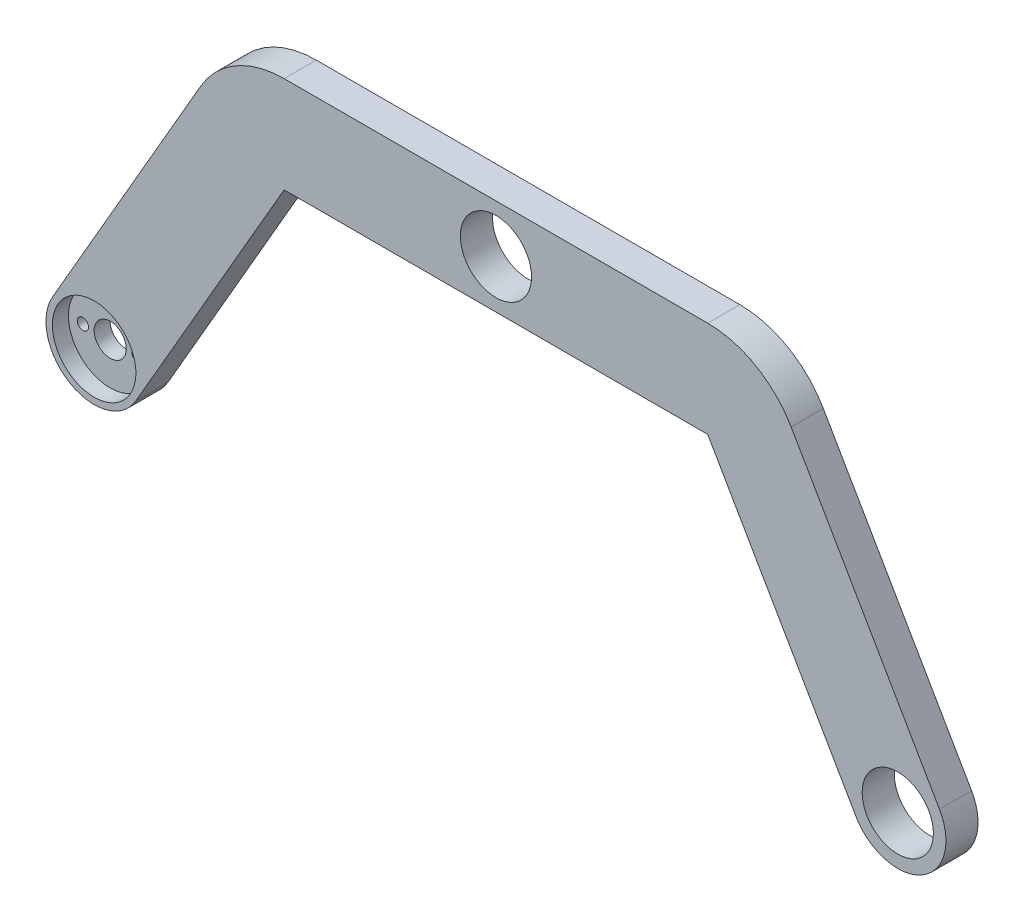
ISO-10303-21;
HEADER;
FILE_DESCRIPTION(('STEP AP214'),'2;1');
FILE_NAME('part.step','',(''),(''),'','','');
FILE_SCHEMA(('AUTOMOTIVE_DESIGN { 1 0 10303 214 1 1 1 1 }'));
ENDSEC;
DATA;
#1=APPLICATION_CONTEXT('core data for automotive mechanical design processes');
#2=APPLICATION_PROTOCOL_DEFINITION('international standard','automotive_design',2000,#1);
#3=PRODUCT_CONTEXT('',#1,'mechanical');
#4=PRODUCT('Part','Part','',(#3));
#5=PRODUCT_RELATED_PRODUCT_CATEGORY('part','',(#4));
#6=PRODUCT_DEFINITION_FORMATION('','',#4);
#7=PRODUCT_DEFINITION_CONTEXT('part definition',#1,'design');
#8=PRODUCT_DEFINITION('design','',#6,#7);
#9=PRODUCT_DEFINITION_SHAPE('','',#8);
#10=(LENGTH_UNIT() NAMED_UNIT(*) SI_UNIT(.MILLI.,.METRE.));
#11=(NAMED_UNIT(*) PLANE_ANGLE_UNIT() SI_UNIT($,.RADIAN.));
#12=(NAMED_UNIT(*) SI_UNIT($,.STERADIAN.) SOLID_ANGLE_UNIT());
#13=UNCERTAINTY_MEASURE_WITH_UNIT(LENGTH_MEASURE(1.E-05),#10,'distance_accuracy_value','');
#14=(GEOMETRIC_REPRESENTATION_CONTEXT(3) GLOBAL_UNCERTAINTY_ASSIGNED_CONTEXT((#13)) GLOBAL_UNIT_ASSIGNED_CONTEXT((#10,
#11,#12)) REPRESENTATION_CONTEXT('',''));
#15=CARTESIAN_POINT('',(0.,0.,0.));
#16=DIRECTION('',(0.,0.,1.));
#17=DIRECTION('',(1.,0.,0.));
#18=AXIS2_PLACEMENT_3D('',#15,#16,#17);
#19=CARTESIAN_POINT('',(-133.644870925994,-87.5182766758698,-10.));
#20=DIRECTION('',(0.,0.,1.));
#21=DIRECTION('',(-1.,0.,0.));
#22=AXIS2_PLACEMENT_3D('',#19,#20,#21);
#23=CYLINDRICAL_SURFACE('',#22,1.75000000000001);
#24=CARTESIAN_POINT('',(-133.644870925994,-87.5182766758698,-10.));
#25=DIRECTION('',(0.,0.,1.));
#26=DIRECTION('',(1.,0.,0.));
#27=AXIS2_PLACEMENT_3D('',#24,#25,#26);
#28=CIRCLE('',#27,1.75000000000001);
#29=CARTESIAN_POINT('',(-131.894870925994,-87.5182766758698,-10.));
#30=VERTEX_POINT('',#29);
#31=EDGE_CURVE('E156',#30,#30,#28,.T.);
#32=ORIENTED_EDGE('',*,*,#31,.F.);
#33=EDGE_LOOP('',(#32));
#34=FACE_BOUND('',#33,.T.);
#35=CARTESIAN_POINT('',(-133.644870925994,-87.5182766758698,-5.));
#36=DIRECTION('',(0.,0.,-1.));
#37=DIRECTION('',(-1.,0.,0.));
#38=AXIS2_PLACEMENT_3D('',#35,#36,#37);
#39=CIRCLE('',#38,1.75000000000001);
#40=CARTESIAN_POINT('',(-135.394870925994,-87.5182766758698,-5.));
#41=VERTEX_POINT('',#40);
#42=EDGE_CURVE('E446',#41,#41,#39,.T.);
#43=ORIENTED_EDGE('',*,*,#42,.F.);
#44=EDGE_LOOP('',(#43));
#45=FACE_BOUND('',#44,.T.);
#46=ADVANCED_FACE('F41',(#34,#45),#23,.F.);
#47=CARTESIAN_POINT('',(-116.644870925994,-87.5182766758698,-10.));
#48=DIRECTION('',(0.,0.,1.));
#49=DIRECTION('',(-1.,0.,0.));
#50=AXIS2_PLACEMENT_3D('',#47,#48,#49);
#51=CYLINDRICAL_SURFACE('',#50,1.75000000000004);
#52=CARTESIAN_POINT('',(-116.644870925994,-87.5182766758698,-10.));
#53=DIRECTION('',(0.,0.,1.));
#54=DIRECTION('',(1.,0.,0.));
#55=AXIS2_PLACEMENT_3D('',#52,#53,#54);
#56=CIRCLE('',#55,1.75000000000004);
#57=CARTESIAN_POINT('',(-114.894870925994,-87.5182766758698,-10.));
#58=VERTEX_POINT('',#57);
#59=EDGE_CURVE('E465',#58,#58,#56,.T.);
#60=ORIENTED_EDGE('',*,*,#59,.F.);
#61=EDGE_LOOP('',(#60));
#62=FACE_BOUND('',#61,.T.);
#63=CARTESIAN_POINT('',(-116.644870925994,-87.5182766758698,-5.));
#64=DIRECTION('',(0.,0.,-1.));
#65=DIRECTION('',(-1.,0.,0.));
#66=AXIS2_PLACEMENT_3D('',#63,#64,#65);
#67=CIRCLE('',#66,1.75000000000004);
#68=CARTESIAN_POINT('',(-118.394870925994,-87.5182766758698,-5.));
#69=VERTEX_POINT('',#68);
#70=EDGE_CURVE('E443',#69,#69,#67,.T.);
#71=ORIENTED_EDGE('',*,*,#70,.F.);
#72=EDGE_LOOP('',(#71));
#73=FACE_BOUND('',#72,.T.);
#74=ADVANCED_FACE('F239',(#62,#73),#51,.F.);
#75=CARTESIAN_POINT('',(-125.144870925994,-87.5182766758698,31.3601857456234));
#76=DIRECTION('',(0.,0.,-1.));
#77=DIRECTION('',(1.,0.,0.));
#78=AXIS2_PLACEMENT_3D('',#75,#76,#77);
#79=CYLINDRICAL_SURFACE('',#78,5.00000000000001);
#80=CARTESIAN_POINT('',(-125.144870925994,-87.5182766758698,-10.));
#81=DIRECTION('',(0.,0.,1.));
#82=DIRECTION('',(1.,0.,0.));
#83=AXIS2_PLACEMENT_3D('',#80,#81,#82);
#84=CIRCLE('',#83,5.00000000000001);
#85=CARTESIAN_POINT('',(-120.144870925994,-87.5182766758698,-10.));
#86=VERTEX_POINT('',#85);
#87=EDGE_CURVE('E439',#86,#86,#84,.T.);
#88=ORIENTED_EDGE('',*,*,#87,.F.);
#89=EDGE_LOOP('',(#88));
#90=FACE_BOUND('',#89,.T.);
#91=CARTESIAN_POINT('',(-125.144870925994,-87.5182766758698,-5.));
#92=DIRECTION('',(0.,0.,-1.));
#93=DIRECTION('',(-1.,0.,0.));
#94=AXIS2_PLACEMENT_3D('',#91,#92,#93);
#95=CIRCLE('',#94,5.00000000000001);
#96=CARTESIAN_POINT('',(-130.144870925994,-87.5182766758698,-5.));
#97=VERTEX_POINT('',#96);
#98=EDGE_CURVE('E45',#97,#97,#95,.F.);
#99=ORIENTED_EDGE('',*,*,#98,.T.);
#100=EDGE_LOOP('',(#99));
#101=FACE_BOUND('',#100,.T.);
#102=ADVANCED_FACE('F245',(#90,#101),#79,.F.);
#103=CARTESIAN_POINT('',(-65.9559162903232,-15.,-10.));
#104=DIRECTION('',(0.,0.,1.));
#105=DIRECTION('',(-1.,0.,0.));
#106=AXIS2_PLACEMENT_3D('',#103,#104,#105);
#107=PLANE('',#106);
#108=CARTESIAN_POINT('',(0.,0.,-10.));
#109=DIRECTION('',(0.,0.,1.));
#110=DIRECTION('',(1.,0.,0.));
#111=AXIS2_PLACEMENT_3D('',#108,#109,#110);
#112=CIRCLE('',#111,11.0875);
#113=CARTESIAN_POINT('',(11.0875,0.,-10.));
#114=VERTEX_POINT('',#113);
#115=EDGE_CURVE('E459',#114,#114,#112,.T.);
#116=ORIENTED_EDGE('',*,*,#115,.T.);
#117=EDGE_LOOP('',(#116));
#118=FACE_BOUND('',#117,.T.);
#119=ORIENTED_EDGE('',*,*,#87,.T.);
#120=EDGE_LOOP('',(#119));
#121=FACE_BOUND('',#120,.T.);
#122=CARTESIAN_POINT('',(125.144870925994,-87.5182766758698,-10.));
#123=DIRECTION('',(0.,0.,1.));
#124=DIRECTION('',(1.,0.,0.));
#125=AXIS2_PLACEMENT_3D('',#122,#123,#124);
#126=CIRCLE('',#125,11.0875);
#127=CARTESIAN_POINT('',(136.232370925994,-87.5182766758698,-10.));
#128=VERTEX_POINT('',#127);
#129=EDGE_CURVE('E467',#128,#128,#126,.T.);
#130=ORIENTED_EDGE('',*,*,#129,.T.);
#131=EDGE_LOOP('',(#130));
#132=FACE_BOUND('',#131,.T.);
#133=CARTESIAN_POINT('',(-65.9559162903232,-15.,-10.));
#134=DIRECTION('',(0.,0.,1.));
#135=DIRECTION('',(-1.,0.,0.));
#136=AXIS2_PLACEMENT_3D('',#133,#134,#135);
#137=CIRCLE('',#136,30.);
#138=CARTESIAN_POINT('',(-65.9559162903232,15.,-10.));
#139=VERTEX_POINT('',#138);
#140=CARTESIAN_POINT('',(-91.9366784038563,1.1462000959634E-13,-10.));
#141=VERTEX_POINT('',#140);
#142=EDGE_CURVE('E179',#139,#141,#137,.T.);
#143=ORIENTED_EDGE('',*,*,#142,.F.);
#144=DIRECTION('',(-1.,0.,0.));
#145=VECTOR('',#144,1.);
#146=CARTESIAN_POINT('',(65.9559162903232,15.,-10.));
#147=LINE('',#146,#145);
#148=CARTESIAN_POINT('',(65.9559162903232,15.,-10.));
#149=VERTEX_POINT('',#148);
#150=EDGE_CURVE('E147',#149,#139,#147,.T.);
#151=ORIENTED_EDGE('',*,*,#150,.F.);
#152=CARTESIAN_POINT('',(65.9559162903232,-15.,-10.));
#153=DIRECTION('',(0.,0.,1.));
#154=DIRECTION('',(1.,0.,0.));
#155=AXIS2_PLACEMENT_3D('',#152,#153,#154);
#156=CIRCLE('',#155,30.);
#157=CARTESIAN_POINT('',(91.9366784038563,1.16226472890446E-13,-10.));
#158=VERTEX_POINT('',#157);
#159=EDGE_CURVE('E127',#158,#149,#156,.T.);
#160=ORIENTED_EDGE('',*,*,#159,.F.);
#161=DIRECTION('',(-0.500000000000004,0.866025403784436,0.));
#162=VECTOR('',#161,1.);
#163=CARTESIAN_POINT('',(138.13525198276,-80.0182766758697,-10.));
#164=LINE('',#163,#162);
#165=CARTESIAN_POINT('',(138.13525198276,-80.0182766758697,-10.));
#166=VERTEX_POINT('',#165);
#167=EDGE_CURVE('E137',#166,#158,#164,.T.);
#168=ORIENTED_EDGE('',*,*,#167,.F.);
#169=CARTESIAN_POINT('',(125.144870925994,-87.5182766758698,-10.));
#170=DIRECTION('',(0.,0.,1.));
#171=DIRECTION('',(1.,0.,0.));
#172=AXIS2_PLACEMENT_3D('',#169,#170,#171);
#173=CIRCLE('',#172,15.);
#174=CARTESIAN_POINT('',(112.154489869227,-95.0182766758698,-10.));
#175=VERTEX_POINT('',#174);
#176=EDGE_CURVE('E142',#175,#166,#173,.T.);
#177=ORIENTED_EDGE('',*,*,#176,.F.);
#178=DIRECTION('',(0.500000000000004,-0.866025403784436,0.));
#179=VECTOR('',#178,1.);
#180=CARTESIAN_POINT('',(65.9559162903232,-15.,-10.));
#181=LINE('',#180,#179);
#182=CARTESIAN_POINT('',(65.9559162903232,-15.,-10.));
#183=VERTEX_POINT('',#182);
#184=EDGE_CURVE('E214',#183,#175,#181,.T.);
#185=ORIENTED_EDGE('',*,*,#184,.F.);
#186=DIRECTION('',(1.,0.,0.));
#187=VECTOR('',#186,1.);
#188=CARTESIAN_POINT('',(65.9559162903232,-15.,-10.));
#189=LINE('',#188,#187);
#190=CARTESIAN_POINT('',(-65.9559162903232,-15.,-10.));
#191=VERTEX_POINT('',#190);
#192=EDGE_CURVE('E211',#191,#183,#189,.T.);
#193=ORIENTED_EDGE('',*,*,#192,.F.);
#194=DIRECTION('',(0.500000000000004,0.866025403784436,0.));
#195=VECTOR('',#194,1.);
#196=CARTESIAN_POINT('',(-65.9559162903232,-15.,-10.));
#197=LINE('',#196,#195);
#198=CARTESIAN_POINT('',(-112.154489869227,-95.0182766758698,-10.));
#199=VERTEX_POINT('',#198);
#200=EDGE_CURVE('E208',#199,#191,#197,.T.);
#201=ORIENTED_EDGE('',*,*,#200,.F.);
#202=CARTESIAN_POINT('',(-125.144870925994,-87.5182766758698,-10.));
#203=DIRECTION('',(0.,0.,1.));
#204=DIRECTION('',(1.,0.,0.));
#205=AXIS2_PLACEMENT_3D('',#202,#203,#204);
#206=CIRCLE('',#205,15.);
#207=CARTESIAN_POINT('',(-138.13525198276,-80.0182766758697,-10.));
#208=VERTEX_POINT('',#207);
#209=EDGE_CURVE('E202',#208,#199,#206,.T.);
#210=ORIENTED_EDGE('',*,*,#209,.F.);
#211=DIRECTION('',(-0.500000000000004,-0.866025403784436,0.));
#212=VECTOR('',#211,1.);
#213=CARTESIAN_POINT('',(-138.13525198276,-80.0182766758697,-10.));
#214=LINE('',#213,#212);
#215=EDGE_CURVE('E193',#141,#208,#214,.T.);
#216=ORIENTED_EDGE('',*,*,#215,.F.);
#217=EDGE_LOOP('',(#143,#151,#160,#168,#177,#185,#193,#201,#210,#216));
#218=FACE_BOUND('',#217,.T.);
#219=ORIENTED_EDGE('',*,*,#31,.T.);
#220=EDGE_LOOP('',(#219));
#221=FACE_BOUND('',#220,.T.);
#222=ORIENTED_EDGE('',*,*,#59,.T.);
#223=EDGE_LOOP('',(#222));
#224=FACE_BOUND('',#223,.T.);
#225=ADVANCED_FACE('F145',(#118,#121,#132,#218,#221,#224),#107,.F.);
#226=CARTESIAN_POINT('',(-65.9559162903232,-15.,0.));
#227=DIRECTION('',(0.,0.,1.));
#228=DIRECTION('',(-1.,0.,0.));
#229=AXIS2_PLACEMENT_3D('',#226,#227,#228);
#230=PLANE('',#229);
#231=CARTESIAN_POINT('',(-125.144870925994,-87.5182766758698,0.));
#232=DIRECTION('',(0.,0.,-1.));
#233=DIRECTION('',(-1.,0.,0.));
#234=AXIS2_PLACEMENT_3D('',#231,#232,#233);
#235=CIRCLE('',#234,13.);
#236=CARTESIAN_POINT('',(-138.144870925994,-87.5182766758698,0.));
#237=VERTEX_POINT('',#236);
#238=EDGE_CURVE('E449',#237,#237,#235,.T.);
#239=ORIENTED_EDGE('',*,*,#238,.T.);
#240=EDGE_LOOP('',(#239));
#241=FACE_BOUND('',#240,.T.);
#242=CARTESIAN_POINT('',(0.,0.,0.));
#243=DIRECTION('',(0.,0.,-1.));
#244=DIRECTION('',(-1.,0.,0.));
#245=AXIS2_PLACEMENT_3D('',#242,#243,#244);
#246=CIRCLE('',#245,11.0875);
#247=CARTESIAN_POINT('',(-11.0875,0.,0.));
#248=VERTEX_POINT('',#247);
#249=EDGE_CURVE('E462',#248,#248,#246,.F.);
#250=ORIENTED_EDGE('',*,*,#249,.F.);
#251=EDGE_LOOP('',(#250));
#252=FACE_BOUND('',#251,.T.);
#253=CARTESIAN_POINT('',(125.144870925994,-87.5182766758698,0.));
#254=DIRECTION('',(0.,0.,-1.));
#255=DIRECTION('',(-1.,0.,0.));
#256=AXIS2_PLACEMENT_3D('',#253,#254,#255);
#257=CIRCLE('',#256,11.0875);
#258=CARTESIAN_POINT('',(114.057370925994,-87.5182766758698,0.));
#259=VERTEX_POINT('',#258);
#260=EDGE_CURVE('E458',#259,#259,#257,.F.);
#261=ORIENTED_EDGE('',*,*,#260,.F.);
#262=EDGE_LOOP('',(#261));
#263=FACE_BOUND('',#262,.T.);
#264=CARTESIAN_POINT('',(-65.9559162903232,-15.,0.));
#265=DIRECTION('',(0.,0.,1.));
#266=DIRECTION('',(-1.,0.,0.));
#267=AXIS2_PLACEMENT_3D('',#264,#265,#266);
#268=CIRCLE('',#267,30.);
#269=CARTESIAN_POINT('',(-65.9559162903232,15.,0.));
#270=VERTEX_POINT('',#269);
#271=CARTESIAN_POINT('',(-91.9366784038563,1.1462000959634E-13,0.));
#272=VERTEX_POINT('',#271);
#273=EDGE_CURVE('E152',#270,#272,#268,.T.);
#274=ORIENTED_EDGE('',*,*,#273,.T.);
#275=DIRECTION('',(-0.500000000000004,-0.866025403784436,0.));
#276=VECTOR('',#275,1.);
#277=CARTESIAN_POINT('',(-138.13525198276,-80.0182766758697,0.));
#278=LINE('',#277,#276);
#279=CARTESIAN_POINT('',(-138.13525198276,-80.0182766758697,0.));
#280=VERTEX_POINT('',#279);
#281=EDGE_CURVE('E155',#272,#280,#278,.T.);
#282=ORIENTED_EDGE('',*,*,#281,.T.);
#283=CARTESIAN_POINT('',(-125.144870925994,-87.5182766758698,0.));
#284=DIRECTION('',(0.,0.,1.));
#285=DIRECTION('',(1.,0.,0.));
#286=AXIS2_PLACEMENT_3D('',#283,#284,#285);
#287=CIRCLE('',#286,15.);
#288=CARTESIAN_POINT('',(-112.154489869227,-95.0182766758698,0.));
#289=VERTEX_POINT('',#288);
#290=EDGE_CURVE('E159',#280,#289,#287,.T.);
#291=ORIENTED_EDGE('',*,*,#290,.T.);
#292=DIRECTION('',(0.500000000000004,0.866025403784436,0.));
#293=VECTOR('',#292,1.);
#294=CARTESIAN_POINT('',(-65.9559162903232,-15.,0.));
#295=LINE('',#294,#293);
#296=CARTESIAN_POINT('',(-65.9559162903232,-15.,0.));
#297=VERTEX_POINT('',#296);
#298=EDGE_CURVE('E162',#289,#297,#295,.T.);
#299=ORIENTED_EDGE('',*,*,#298,.T.);
#300=DIRECTION('',(1.,0.,0.));
#301=VECTOR('',#300,1.);
#302=CARTESIAN_POINT('',(65.9559162903232,-15.,0.));
#303=LINE('',#302,#301);
#304=CARTESIAN_POINT('',(65.9559162903232,-15.,0.));
#305=VERTEX_POINT('',#304);
#306=EDGE_CURVE('E165',#297,#305,#303,.T.);
#307=ORIENTED_EDGE('',*,*,#306,.T.);
#308=DIRECTION('',(0.500000000000004,-0.866025403784436,0.));
#309=VECTOR('',#308,1.);
#310=CARTESIAN_POINT('',(65.9559162903232,-15.,0.));
#311=LINE('',#310,#309);
#312=CARTESIAN_POINT('',(112.154489869227,-95.0182766758698,0.));
#313=VERTEX_POINT('',#312);
#314=EDGE_CURVE('E168',#305,#313,#311,.T.);
#315=ORIENTED_EDGE('',*,*,#314,.T.);
#316=CARTESIAN_POINT('',(125.144870925994,-87.5182766758698,0.));
#317=DIRECTION('',(0.,0.,1.));
#318=DIRECTION('',(1.,0.,0.));
#319=AXIS2_PLACEMENT_3D('',#316,#317,#318);
#320=CIRCLE('',#319,15.);
#321=CARTESIAN_POINT('',(138.13525198276,-80.0182766758697,0.));
#322=VERTEX_POINT('',#321);
#323=EDGE_CURVE('E171',#313,#322,#320,.T.);
#324=ORIENTED_EDGE('',*,*,#323,.T.);
#325=DIRECTION('',(-0.500000000000004,0.866025403784436,0.));
#326=VECTOR('',#325,1.);
#327=CARTESIAN_POINT('',(138.13525198276,-80.0182766758697,0.));
#328=LINE('',#327,#326);
#329=CARTESIAN_POINT('',(91.9366784038563,1.16226472890446E-13,0.));
#330=VERTEX_POINT('',#329);
#331=EDGE_CURVE('E174',#322,#330,#328,.T.);
#332=ORIENTED_EDGE('',*,*,#331,.T.);
#333=CARTESIAN_POINT('',(65.9559162903232,-15.,0.));
#334=DIRECTION('',(0.,0.,1.));
#335=DIRECTION('',(1.,0.,0.));
#336=AXIS2_PLACEMENT_3D('',#333,#334,#335);
#337=CIRCLE('',#336,30.);
#338=CARTESIAN_POINT('',(65.9559162903232,15.,0.));
#339=VERTEX_POINT('',#338);
#340=EDGE_CURVE('E130',#330,#339,#337,.T.);
#341=ORIENTED_EDGE('',*,*,#340,.T.);
#342=DIRECTION('',(-1.,0.,0.));
#343=VECTOR('',#342,1.);
#344=CARTESIAN_POINT('',(65.9559162903232,15.,0.));
#345=LINE('',#344,#343);
#346=EDGE_CURVE('E177',#339,#270,#345,.T.);
#347=ORIENTED_EDGE('',*,*,#346,.T.);
#348=EDGE_LOOP('',(#274,#282,#291,#299,#307,#315,#324,#332,#341,#347));
#349=FACE_BOUND('',#348,.T.);
#350=ADVANCED_FACE('F200',(#241,#252,#263,#349),#230,.T.);
#351=CARTESIAN_POINT('',(-65.9559162903232,-15.,-10.));
#352=DIRECTION('',(0.,0.,1.));
#353=DIRECTION('',(-1.,0.,0.));
#354=AXIS2_PLACEMENT_3D('',#351,#352,#353);
#355=CYLINDRICAL_SURFACE('',#354,30.);
#356=ORIENTED_EDGE('',*,*,#273,.F.);
#357=DIRECTION('',(0.,0.,1.));
#358=VECTOR('',#357,1.);
#359=CARTESIAN_POINT('',(-65.9559162903232,15.,-10.));
#360=LINE('',#359,#358);
#361=EDGE_CURVE('E59',#139,#270,#360,.T.);
#362=ORIENTED_EDGE('',*,*,#361,.F.);
#363=ORIENTED_EDGE('',*,*,#142,.T.);
#364=DIRECTION('',(0.,0.,1.));
#365=VECTOR('',#364,1.);
#366=CARTESIAN_POINT('',(-91.9366784038563,1.1462000959634E-13,-10.));
#367=LINE('',#366,#365);
#368=EDGE_CURVE('E12',#141,#272,#367,.T.);
#369=ORIENTED_EDGE('',*,*,#368,.T.);
#370=EDGE_LOOP('',(#356,#362,#363,#369));
#371=FACE_BOUND('',#370,.T.);
#372=ADVANCED_FACE('F43',(#371),#355,.T.);
#373=CARTESIAN_POINT('',(-138.13525198276,-80.0182766758697,-10.));
#374=DIRECTION('',(0.866025403784436,-0.500000000000004,0.));
#375=DIRECTION('',(0.500000000000004,0.866025403784436,0.));
#376=AXIS2_PLACEMENT_3D('',#373,#374,#375);
#377=PLANE('',#376);
#378=ORIENTED_EDGE('',*,*,#281,.F.);
#379=ORIENTED_EDGE('',*,*,#368,.F.);
#380=ORIENTED_EDGE('',*,*,#215,.T.);
#381=DIRECTION('',(0.,0.,1.));
#382=VECTOR('',#381,1.);
#383=CARTESIAN_POINT('',(-138.13525198276,-80.0182766758697,-10.));
#384=LINE('',#383,#382);
#385=EDGE_CURVE('E51',#208,#280,#384,.T.);
#386=ORIENTED_EDGE('',*,*,#385,.T.);
#387=EDGE_LOOP('',(#378,#379,#380,#386));
#388=FACE_BOUND('',#387,.T.);
#389=ADVANCED_FACE('F192',(#388),#377,.F.);
#390=CARTESIAN_POINT('',(-125.144870925994,-87.5182766758698,-10.));
#391=DIRECTION('',(0.,0.,1.));
#392=DIRECTION('',(-1.,0.,0.));
#393=AXIS2_PLACEMENT_3D('',#390,#391,#392);
#394=CYLINDRICAL_SURFACE('',#393,15.);
#395=ORIENTED_EDGE('',*,*,#290,.F.);
#396=ORIENTED_EDGE('',*,*,#385,.F.);
#397=ORIENTED_EDGE('',*,*,#209,.T.);
#398=DIRECTION('',(0.,0.,1.));
#399=VECTOR('',#398,1.);
#400=CARTESIAN_POINT('',(-112.154489869227,-95.0182766758698,-10.));
#401=LINE('',#400,#399);
#402=EDGE_CURVE('E189',#199,#289,#401,.T.);
#403=ORIENTED_EDGE('',*,*,#402,.T.);
#404=EDGE_LOOP('',(#395,#396,#397,#403));
#405=FACE_BOUND('',#404,.T.);
#406=ADVANCED_FACE('F197',(#405),#394,.T.);
#407=CARTESIAN_POINT('',(-65.9559162903232,-15.,-10.));
#408=DIRECTION('',(-0.866025403784436,0.500000000000004,0.));
#409=DIRECTION('',(-0.500000000000004,-0.866025403784436,0.));
#410=AXIS2_PLACEMENT_3D('',#407,#408,#409);
#411=PLANE('',#410);
#412=ORIENTED_EDGE('',*,*,#298,.F.);
#413=ORIENTED_EDGE('',*,*,#402,.F.);
#414=ORIENTED_EDGE('',*,*,#200,.T.);
#415=DIRECTION('',(0.,0.,1.));
#416=VECTOR('',#415,1.);
#417=CARTESIAN_POINT('',(-65.9559162903232,-15.,-10.));
#418=LINE('',#417,#416);
#419=EDGE_CURVE('E187',#191,#297,#418,.T.);
#420=ORIENTED_EDGE('',*,*,#419,.T.);
#421=EDGE_LOOP('',(#412,#413,#414,#420));
#422=FACE_BOUND('',#421,.T.);
#423=ADVANCED_FACE('F229',(#422),#411,.F.);
#424=CARTESIAN_POINT('',(65.9559162903232,-15.,-10.));
#425=DIRECTION('',(0.,1.,0.));
#426=DIRECTION('',(0.,0.,-1.));
#427=AXIS2_PLACEMENT_3D('',#424,#425,#426);
#428=PLANE('',#427);
#429=ORIENTED_EDGE('',*,*,#306,.F.);
#430=ORIENTED_EDGE('',*,*,#419,.F.);
#431=ORIENTED_EDGE('',*,*,#192,.T.);
#432=DIRECTION('',(0.,0.,1.));
#433=VECTOR('',#432,1.);
#434=CARTESIAN_POINT('',(65.9559162903232,-15.,-10.));
#435=LINE('',#434,#433);
#436=EDGE_CURVE('E185',#183,#305,#435,.T.);
#437=ORIENTED_EDGE('',*,*,#436,.T.);
#438=EDGE_LOOP('',(#429,#430,#431,#437));
#439=FACE_BOUND('',#438,.T.);
#440=ADVANCED_FACE('F227',(#439),#428,.F.);
#441=CARTESIAN_POINT('',(65.9559162903232,-15.,-10.));
#442=DIRECTION('',(0.866025403784436,0.500000000000004,0.));
#443=DIRECTION('',(-0.500000000000004,0.866025403784436,0.));
#444=AXIS2_PLACEMENT_3D('',#441,#442,#443);
#445=PLANE('',#444);
#446=ORIENTED_EDGE('',*,*,#314,.F.);
#447=ORIENTED_EDGE('',*,*,#436,.F.);
#448=ORIENTED_EDGE('',*,*,#184,.T.);
#449=DIRECTION('',(0.,0.,1.));
#450=VECTOR('',#449,1.);
#451=CARTESIAN_POINT('',(112.154489869227,-95.0182766758698,-10.));
#452=LINE('',#451,#450);
#453=EDGE_CURVE('E183',#175,#313,#452,.T.);
#454=ORIENTED_EDGE('',*,*,#453,.T.);
#455=EDGE_LOOP('',(#446,#447,#448,#454));
#456=FACE_BOUND('',#455,.T.);
#457=ADVANCED_FACE('F224',(#456),#445,.F.);
#458=CARTESIAN_POINT('',(125.144870925994,-87.5182766758698,-10.));
#459=DIRECTION('',(0.,0.,1.));
#460=DIRECTION('',(-1.,0.,0.));
#461=AXIS2_PLACEMENT_3D('',#458,#459,#460);
#462=CYLINDRICAL_SURFACE('',#461,15.);
#463=ORIENTED_EDGE('',*,*,#323,.F.);
#464=ORIENTED_EDGE('',*,*,#453,.F.);
#465=ORIENTED_EDGE('',*,*,#176,.T.);
#466=DIRECTION('',(0.,0.,1.));
#467=VECTOR('',#466,1.);
#468=CARTESIAN_POINT('',(138.13525198276,-80.0182766758697,-10.));
#469=LINE('',#468,#467);
#470=EDGE_CURVE('E134',#166,#322,#469,.T.);
#471=ORIENTED_EDGE('',*,*,#470,.T.);
#472=EDGE_LOOP('',(#463,#464,#465,#471));
#473=FACE_BOUND('',#472,.T.);
#474=ADVANCED_FACE('F218',(#473),#462,.T.);
#475=CARTESIAN_POINT('',(138.13525198276,-80.0182766758697,-10.));
#476=DIRECTION('',(-0.866025403784436,-0.500000000000004,0.));
#477=DIRECTION('',(0.500000000000004,-0.866025403784436,0.));
#478=AXIS2_PLACEMENT_3D('',#475,#476,#477);
#479=PLANE('',#478);
#480=ORIENTED_EDGE('',*,*,#331,.F.);
#481=ORIENTED_EDGE('',*,*,#470,.F.);
#482=ORIENTED_EDGE('',*,*,#167,.T.);
#483=DIRECTION('',(0.,0.,1.));
#484=VECTOR('',#483,1.);
#485=CARTESIAN_POINT('',(91.9366784038563,1.16226472890446E-13,-10.));
#486=LINE('',#485,#484);
#487=EDGE_CURVE('E123',#158,#330,#486,.T.);
#488=ORIENTED_EDGE('',*,*,#487,.T.);
#489=EDGE_LOOP('',(#480,#481,#482,#488));
#490=FACE_BOUND('',#489,.T.);
#491=ADVANCED_FACE('F138',(#490),#479,.F.);
#492=CARTESIAN_POINT('',(65.9559162903232,-15.,-10.));
#493=DIRECTION('',(0.,0.,1.));
#494=DIRECTION('',(-1.,0.,0.));
#495=AXIS2_PLACEMENT_3D('',#492,#493,#494);
#496=CYLINDRICAL_SURFACE('',#495,30.);
#497=ORIENTED_EDGE('',*,*,#340,.F.);
#498=ORIENTED_EDGE('',*,*,#487,.F.);
#499=ORIENTED_EDGE('',*,*,#159,.T.);
#500=DIRECTION('',(0.,0.,1.));
#501=VECTOR('',#500,1.);
#502=CARTESIAN_POINT('',(65.9559162903232,15.,-10.));
#503=LINE('',#502,#501);
#504=EDGE_CURVE('E93',#149,#339,#503,.T.);
#505=ORIENTED_EDGE('',*,*,#504,.T.);
#506=EDGE_LOOP('',(#497,#498,#499,#505));
#507=FACE_BOUND('',#506,.T.);
#508=ADVANCED_FACE('F125',(#507),#496,.T.);
#509=CARTESIAN_POINT('',(65.9559162903232,15.,-10.));
#510=DIRECTION('',(0.,-1.,0.));
#511=DIRECTION('',(0.,0.,1.));
#512=AXIS2_PLACEMENT_3D('',#509,#510,#511);
#513=PLANE('',#512);
#514=ORIENTED_EDGE('',*,*,#346,.F.);
#515=ORIENTED_EDGE('',*,*,#504,.F.);
#516=ORIENTED_EDGE('',*,*,#150,.T.);
#517=ORIENTED_EDGE('',*,*,#361,.T.);
#518=EDGE_LOOP('',(#514,#515,#516,#517));
#519=FACE_BOUND('',#518,.T.);
#520=ADVANCED_FACE('F258',(#519),#513,.F.);
#521=CARTESIAN_POINT('',(125.144870925994,-87.5182766758698,31.3601857456234));
#522=DIRECTION('',(0.,0.,-1.));
#523=DIRECTION('',(1.,0.,0.));
#524=AXIS2_PLACEMENT_3D('',#521,#522,#523);
#525=CYLINDRICAL_SURFACE('',#524,11.0875);
#526=ORIENTED_EDGE('',*,*,#129,.F.);
#527=EDGE_LOOP('',(#526));
#528=FACE_BOUND('',#527,.T.);
#529=ORIENTED_EDGE('',*,*,#260,.T.);
#530=EDGE_LOOP('',(#529));
#531=FACE_BOUND('',#530,.T.);
#532=ADVANCED_FACE('F261',(#528,#531),#525,.F.);
#533=CARTESIAN_POINT('',(0.,0.,31.3601857456234));
#534=DIRECTION('',(0.,0.,-1.));
#535=DIRECTION('',(1.,0.,0.));
#536=AXIS2_PLACEMENT_3D('',#533,#534,#535);
#537=CYLINDRICAL_SURFACE('',#536,11.0875);
#538=ORIENTED_EDGE('',*,*,#115,.F.);
#539=EDGE_LOOP('',(#538));
#540=FACE_BOUND('',#539,.T.);
#541=ORIENTED_EDGE('',*,*,#249,.T.);
#542=EDGE_LOOP('',(#541));
#543=FACE_BOUND('',#542,.T.);
#544=ADVANCED_FACE('F295',(#540,#543),#537,.F.);
#545=CARTESIAN_POINT('',(-65.9559162903232,-15.,-5.));
#546=DIRECTION('',(0.,0.,1.));
#547=DIRECTION('',(-1.,0.,0.));
#548=AXIS2_PLACEMENT_3D('',#545,#546,#547);
#549=PLANE('',#548);
#550=ORIENTED_EDGE('',*,*,#42,.T.);
#551=EDGE_LOOP('',(#550));
#552=FACE_BOUND('',#551,.T.);
#553=ORIENTED_EDGE('',*,*,#70,.T.);
#554=EDGE_LOOP('',(#553));
#555=FACE_BOUND('',#554,.T.);
#556=CARTESIAN_POINT('',(-125.144870925994,-87.5182766758698,-5.));
#557=DIRECTION('',(0.,0.,-1.));
#558=DIRECTION('',(-1.,0.,0.));
#559=AXIS2_PLACEMENT_3D('',#556,#557,#558);
#560=CIRCLE('',#559,13.);
#561=CARTESIAN_POINT('',(-138.144870925994,-87.5182766758698,-5.));
#562=VERTEX_POINT('',#561);
#563=EDGE_CURVE('E444',#562,#562,#560,.F.);
#564=ORIENTED_EDGE('',*,*,#563,.T.);
#565=EDGE_LOOP('',(#564));
#566=FACE_BOUND('',#565,.T.);
#567=ORIENTED_EDGE('',*,*,#98,.F.);
#568=EDGE_LOOP('',(#567));
#569=FACE_BOUND('',#568,.T.);
#570=ADVANCED_FACE('F302',(#552,#555,#566,#569),#549,.T.);
#571=CARTESIAN_POINT('',(-125.144870925994,-87.5182766758698,-46.7695526217004));
#572=DIRECTION('',(0.,0.,1.));
#573=DIRECTION('',(-1.,0.,0.));
#574=AXIS2_PLACEMENT_3D('',#571,#572,#573);
#575=CYLINDRICAL_SURFACE('',#574,13.);
#576=ORIENTED_EDGE('',*,*,#563,.F.);
#577=EDGE_LOOP('',(#576));
#578=FACE_BOUND('',#577,.T.);
#579=ORIENTED_EDGE('',*,*,#238,.F.);
#580=EDGE_LOOP('',(#579));
#581=FACE_BOUND('',#580,.T.);
#582=ADVANCED_FACE('F310',(#578,#581),#575,.F.);
#583=CLOSED_SHELL('',(#46,#74,#102,#225,#350,#372,#389,#406,#423,#440,#457,#474,#491,#508,#520,
#532,#544,#570,#582));
#584=MANIFOLD_SOLID_BREP('B2',#583);
#585=ADVANCED_BREP_SHAPE_REPRESENTATION('',(#18,#584),#14);
#586=SHAPE_DEFINITION_REPRESENTATION(#9,#585);
ENDSEC;
END-ISO-10303-21;
